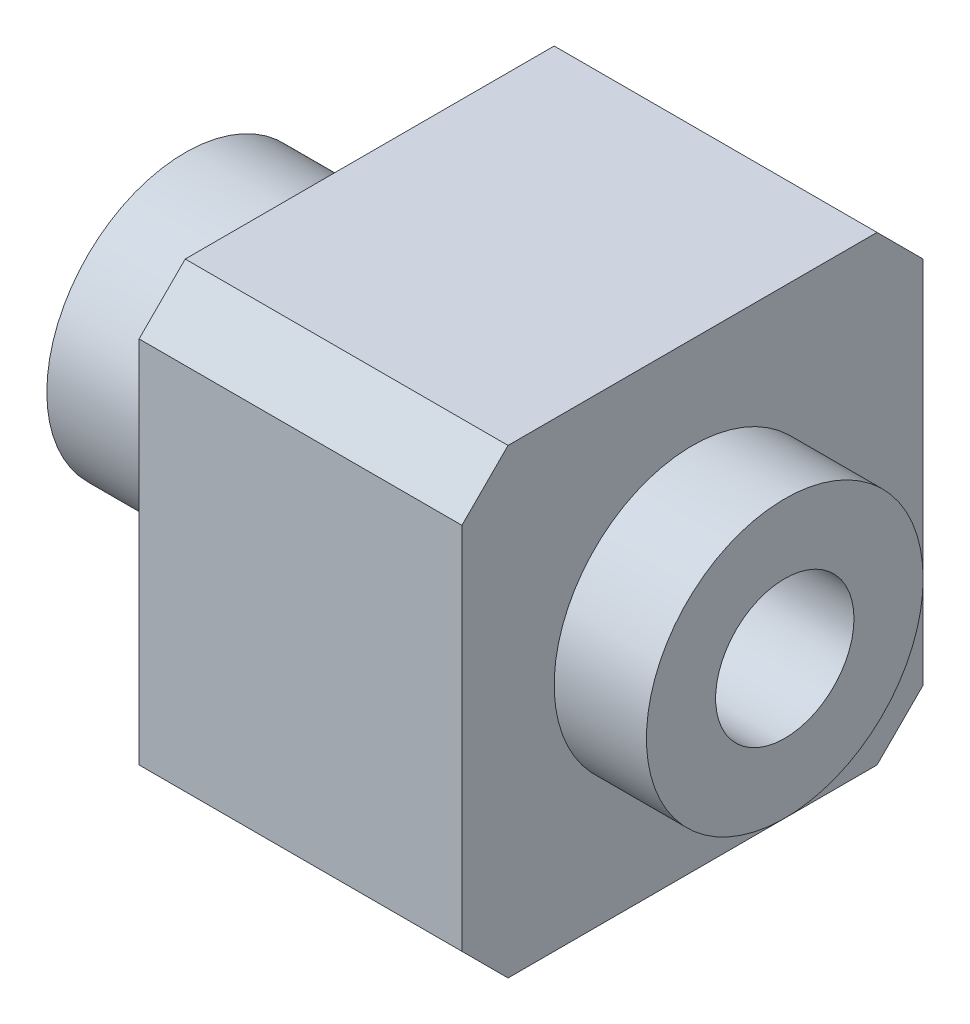
ISO-10303-21;
HEADER;
FILE_DESCRIPTION(('STEP AP214'),'2;1');
FILE_NAME('part.step','',(''),(''),'','','');
FILE_SCHEMA(('AUTOMOTIVE_DESIGN { 1 0 10303 214 1 1 1 1 }'));
ENDSEC;
DATA;
#1=APPLICATION_CONTEXT('core data for automotive mechanical design processes');
#2=APPLICATION_PROTOCOL_DEFINITION('international standard','automotive_design',2000,#1);
#3=PRODUCT_CONTEXT('',#1,'mechanical');
#4=PRODUCT('Part','Part','',(#3));
#5=PRODUCT_RELATED_PRODUCT_CATEGORY('part','',(#4));
#6=PRODUCT_DEFINITION_FORMATION('','',#4);
#7=PRODUCT_DEFINITION_CONTEXT('part definition',#1,'design');
#8=PRODUCT_DEFINITION('design','',#6,#7);
#9=PRODUCT_DEFINITION_SHAPE('','',#8);
#10=(LENGTH_UNIT() NAMED_UNIT(*) SI_UNIT(.MILLI.,.METRE.));
#11=(NAMED_UNIT(*) PLANE_ANGLE_UNIT() SI_UNIT($,.RADIAN.));
#12=(NAMED_UNIT(*) SI_UNIT($,.STERADIAN.) SOLID_ANGLE_UNIT());
#13=UNCERTAINTY_MEASURE_WITH_UNIT(LENGTH_MEASURE(1.E-05),#10,'distance_accuracy_value','');
#14=(GEOMETRIC_REPRESENTATION_CONTEXT(3) GLOBAL_UNCERTAINTY_ASSIGNED_CONTEXT((#13)) GLOBAL_UNIT_ASSIGNED_CONTEXT((#10,
#11,#12)) REPRESENTATION_CONTEXT('',''));
#15=CARTESIAN_POINT('',(0.,0.,0.));
#16=DIRECTION('',(0.,0.,1.));
#17=DIRECTION('',(1.,0.,0.));
#18=AXIS2_PLACEMENT_3D('',#15,#16,#17);
#19=CARTESIAN_POINT('',(-13.,-5.,5.));
#20=DIRECTION('',(0.,0.,1.));
#21=DIRECTION('',(1.,0.,0.));
#22=AXIS2_PLACEMENT_3D('',#19,#20,#21);
#23=PLANE('',#22);
#24=DIRECTION('',(0.,1.,0.));
#25=VECTOR('',#24,1.);
#26=CARTESIAN_POINT('',(-2.,-5.,5.));
#27=LINE('',#26,#25);
#28=CARTESIAN_POINT('',(-2.,-4.,5.));
#29=VERTEX_POINT('',#28);
#30=CARTESIAN_POINT('',(-2.,4.,5.));
#31=VERTEX_POINT('',#30);
#32=EDGE_CURVE('E131',#29,#31,#27,.T.);
#33=ORIENTED_EDGE('',*,*,#32,.T.);
#34=DIRECTION('',(-1.,0.,0.));
#35=VECTOR('',#34,1.);
#36=CARTESIAN_POINT('',(-13.,4.,5.));
#37=LINE('',#36,#35);
#38=CARTESIAN_POINT('',(-9.,4.,5.));
#39=VERTEX_POINT('',#38);
#40=EDGE_CURVE('E11',#31,#39,#37,.T.);
#41=ORIENTED_EDGE('',*,*,#40,.T.);
#42=DIRECTION('',(0.,-1.,0.));
#43=VECTOR('',#42,1.);
#44=CARTESIAN_POINT('',(-9.,-5.,5.));
#45=LINE('',#44,#43);
#46=CARTESIAN_POINT('',(-9.,-4.,5.));
#47=VERTEX_POINT('',#46);
#48=EDGE_CURVE('E132',#39,#47,#45,.T.);
#49=ORIENTED_EDGE('',*,*,#48,.T.);
#50=DIRECTION('',(1.,0.,0.));
#51=VECTOR('',#50,1.);
#52=CARTESIAN_POINT('',(-13.,-4.,5.));
#53=LINE('',#52,#51);
#54=EDGE_CURVE('E40',#47,#29,#53,.T.);
#55=ORIENTED_EDGE('',*,*,#54,.T.);
#56=EDGE_LOOP('',(#33,#41,#49,#55));
#57=FACE_BOUND('',#56,.T.);
#58=ADVANCED_FACE('F32',(#57),#23,.T.);
#59=CARTESIAN_POINT('',(-13.,5.,-5.));
#60=DIRECTION('',(0.,1.,0.));
#61=DIRECTION('',(0.,0.,1.));
#62=AXIS2_PLACEMENT_3D('',#59,#60,#61);
#63=PLANE('',#62);
#64=DIRECTION('',(0.,0.,1.));
#65=VECTOR('',#64,1.);
#66=CARTESIAN_POINT('',(-9.,5.,-5.));
#67=LINE('',#66,#65);
#68=CARTESIAN_POINT('',(-9.,5.,-4.));
#69=VERTEX_POINT('',#68);
#70=CARTESIAN_POINT('',(-9.,5.,4.));
#71=VERTEX_POINT('',#70);
#72=EDGE_CURVE('E167',#69,#71,#67,.T.);
#73=ORIENTED_EDGE('',*,*,#72,.T.);
#74=DIRECTION('',(1.,0.,0.));
#75=VECTOR('',#74,1.);
#76=CARTESIAN_POINT('',(-13.,5.,4.));
#77=LINE('',#76,#75);
#78=CARTESIAN_POINT('',(-2.,5.,4.));
#79=VERTEX_POINT('',#78);
#80=EDGE_CURVE('E128',#71,#79,#77,.T.);
#81=ORIENTED_EDGE('',*,*,#80,.T.);
#82=DIRECTION('',(0.,0.,-1.));
#83=VECTOR('',#82,1.);
#84=CARTESIAN_POINT('',(-2.,5.,-5.));
#85=LINE('',#84,#83);
#86=CARTESIAN_POINT('',(-2.,5.,-4.));
#87=VERTEX_POINT('',#86);
#88=EDGE_CURVE('E139',#79,#87,#85,.T.);
#89=ORIENTED_EDGE('',*,*,#88,.T.);
#90=DIRECTION('',(-1.,0.,0.));
#91=VECTOR('',#90,1.);
#92=CARTESIAN_POINT('',(-13.,5.,-4.));
#93=LINE('',#92,#91);
#94=EDGE_CURVE('E126',#87,#69,#93,.T.);
#95=ORIENTED_EDGE('',*,*,#94,.T.);
#96=EDGE_LOOP('',(#73,#81,#89,#95));
#97=FACE_BOUND('',#96,.T.);
#98=ADVANCED_FACE('F208',(#97),#63,.T.);
#99=CARTESIAN_POINT('',(-13.,-5.,-5.));
#100=DIRECTION('',(0.,0.,-1.));
#101=DIRECTION('',(-1.,0.,0.));
#102=AXIS2_PLACEMENT_3D('',#99,#100,#101);
#103=PLANE('',#102);
#104=CARTESIAN_POINT('',(-5.5,0.,-5.));
#105=DIRECTION('',(0.,0.,-1.));
#106=DIRECTION('',(-1.,0.,0.));
#107=AXIS2_PLACEMENT_3D('',#104,#105,#106);
#108=CIRCLE('',#107,1.5);
#109=CARTESIAN_POINT('',(-7.,0.,-5.));
#110=VERTEX_POINT('',#109);
#111=EDGE_CURVE('E193',#110,#110,#108,.T.);
#112=ORIENTED_EDGE('',*,*,#111,.F.);
#113=EDGE_LOOP('',(#112));
#114=FACE_BOUND('',#113,.T.);
#115=DIRECTION('',(0.,-1.,0.));
#116=VECTOR('',#115,1.);
#117=CARTESIAN_POINT('',(-2.,-5.,-5.));
#118=LINE('',#117,#116);
#119=CARTESIAN_POINT('',(-2.,4.,-5.));
#120=VERTEX_POINT('',#119);
#121=CARTESIAN_POINT('',(-2.,-3.99999999999999,-5.));
#122=VERTEX_POINT('',#121);
#123=EDGE_CURVE('E143',#120,#122,#118,.T.);
#124=ORIENTED_EDGE('',*,*,#123,.T.);
#125=DIRECTION('',(-1.,0.,0.));
#126=VECTOR('',#125,1.);
#127=CARTESIAN_POINT('',(-13.,-3.99999999999999,-5.));
#128=LINE('',#127,#126);
#129=CARTESIAN_POINT('',(-9.,-3.99999999999999,-5.));
#130=VERTEX_POINT('',#129);
#131=EDGE_CURVE('E121',#122,#130,#128,.T.);
#132=ORIENTED_EDGE('',*,*,#131,.T.);
#133=DIRECTION('',(0.,1.,0.));
#134=VECTOR('',#133,1.);
#135=CARTESIAN_POINT('',(-9.,-5.,-5.));
#136=LINE('',#135,#134);
#137=CARTESIAN_POINT('',(-9.,4.,-5.));
#138=VERTEX_POINT('',#137);
#139=EDGE_CURVE('E161',#130,#138,#136,.T.);
#140=ORIENTED_EDGE('',*,*,#139,.T.);
#141=DIRECTION('',(1.,0.,0.));
#142=VECTOR('',#141,1.);
#143=CARTESIAN_POINT('',(-13.,4.,-5.));
#144=LINE('',#143,#142);
#145=EDGE_CURVE('E154',#138,#120,#144,.T.);
#146=ORIENTED_EDGE('',*,*,#145,.T.);
#147=EDGE_LOOP('',(#124,#132,#140,#146));
#148=FACE_BOUND('',#147,.T.);
#149=ADVANCED_FACE('F160',(#114,#148),#103,.T.);
#150=CARTESIAN_POINT('',(-13.,-5.,-5.));
#151=DIRECTION('',(0.,-1.,0.));
#152=DIRECTION('',(0.,0.,-1.));
#153=AXIS2_PLACEMENT_3D('',#150,#151,#152);
#154=PLANE('',#153);
#155=DIRECTION('',(0.,0.,-1.));
#156=VECTOR('',#155,1.);
#157=CARTESIAN_POINT('',(-9.,-5.,-5.));
#158=LINE('',#157,#156);
#159=CARTESIAN_POINT('',(-9.,-5.,3.99999999999999));
#160=VERTEX_POINT('',#159);
#161=CARTESIAN_POINT('',(-9.,-5.,-3.99999999999999));
#162=VERTEX_POINT('',#161);
#163=EDGE_CURVE('E101',#160,#162,#158,.T.);
#164=ORIENTED_EDGE('',*,*,#163,.T.);
#165=DIRECTION('',(1.,0.,0.));
#166=VECTOR('',#165,1.);
#167=CARTESIAN_POINT('',(-13.,-5.,-3.99999999999999));
#168=LINE('',#167,#166);
#169=CARTESIAN_POINT('',(-2.,-5.,-3.99999999999999));
#170=VERTEX_POINT('',#169);
#171=EDGE_CURVE('E106',#162,#170,#168,.T.);
#172=ORIENTED_EDGE('',*,*,#171,.T.);
#173=DIRECTION('',(0.,0.,1.));
#174=VECTOR('',#173,1.);
#175=CARTESIAN_POINT('',(-2.,-5.,-5.));
#176=LINE('',#175,#174);
#177=CARTESIAN_POINT('',(-2.,-5.,3.99999999999999));
#178=VERTEX_POINT('',#177);
#179=EDGE_CURVE('E104',#170,#178,#176,.T.);
#180=ORIENTED_EDGE('',*,*,#179,.T.);
#181=DIRECTION('',(-1.,0.,0.));
#182=VECTOR('',#181,1.);
#183=CARTESIAN_POINT('',(-13.,-5.,3.99999999999999));
#184=LINE('',#183,#182);
#185=EDGE_CURVE('E98',#178,#160,#184,.T.);
#186=ORIENTED_EDGE('',*,*,#185,.T.);
#187=EDGE_LOOP('',(#164,#172,#180,#186));
#188=FACE_BOUND('',#187,.T.);
#189=ADVANCED_FACE('F99',(#188),#154,.T.);
#190=CARTESIAN_POINT('',(-2.,0.,0.));
#191=DIRECTION('',(1.,0.,0.));
#192=DIRECTION('',(0.,0.,-1.));
#193=AXIS2_PLACEMENT_3D('',#190,#191,#192);
#194=PLANE('',#193);
#195=ORIENTED_EDGE('',*,*,#179,.F.);
#196=DIRECTION('',(0.,-0.707106781186549,0.707106781186546));
#197=VECTOR('',#196,1.);
#198=CARTESIAN_POINT('',(-2.,-4.49999999999998,-4.50000000000001));
#199=LINE('',#198,#197);
#200=EDGE_CURVE('E152',#170,#122,#199,.F.);
#201=ORIENTED_EDGE('',*,*,#200,.T.);
#202=ORIENTED_EDGE('',*,*,#123,.F.);
#203=DIRECTION('',(0.,-0.707106781186547,-0.707106781186548));
#204=VECTOR('',#203,1.);
#205=CARTESIAN_POINT('',(-2.,4.50000000000001,-4.49999999999999));
#206=LINE('',#205,#204);
#207=EDGE_CURVE('E148',#120,#87,#206,.F.);
#208=ORIENTED_EDGE('',*,*,#207,.T.);
#209=ORIENTED_EDGE('',*,*,#88,.F.);
#210=DIRECTION('',(0.,0.707106781186548,-0.707106781186547));
#211=VECTOR('',#210,1.);
#212=CARTESIAN_POINT('',(-2.,4.5,4.5));
#213=LINE('',#212,#211);
#214=EDGE_CURVE('E138',#79,#31,#213,.F.);
#215=ORIENTED_EDGE('',*,*,#214,.T.);
#216=ORIENTED_EDGE('',*,*,#32,.F.);
#217=DIRECTION('',(0.,0.707106781186546,0.707106781186549));
#218=VECTOR('',#217,1.);
#219=CARTESIAN_POINT('',(-2.,-4.50000000000001,4.49999999999999));
#220=LINE('',#219,#218);
#221=EDGE_CURVE('E136',#29,#178,#220,.F.);
#222=ORIENTED_EDGE('',*,*,#221,.T.);
#223=EDGE_LOOP('',(#195,#201,#202,#208,#209,#215,#216,#222));
#224=FACE_BOUND('',#223,.T.);
#225=CARTESIAN_POINT('',(-2.,0.,0.));
#226=DIRECTION('',(1.,0.,0.));
#227=DIRECTION('',(0.,0.,-1.));
#228=AXIS2_PLACEMENT_3D('',#225,#226,#227);
#229=CIRCLE('',#228,3.);
#230=CARTESIAN_POINT('',(-2.,0.,-3.));
#231=VERTEX_POINT('',#230);
#232=EDGE_CURVE('E171',#231,#231,#229,.T.);
#233=ORIENTED_EDGE('',*,*,#232,.F.);
#234=EDGE_LOOP('',(#233));
#235=FACE_BOUND('',#234,.T.);
#236=ADVANCED_FACE('F134',(#224,#235),#194,.T.);
#237=CARTESIAN_POINT('',(-2.,0.,0.));
#238=DIRECTION('',(1.,0.,0.));
#239=DIRECTION('',(0.,0.,-1.));
#240=AXIS2_PLACEMENT_3D('',#237,#238,#239);
#241=CYLINDRICAL_SURFACE('',#240,3.);
#242=ORIENTED_EDGE('',*,*,#232,.T.);
#243=EDGE_LOOP('',(#242));
#244=FACE_BOUND('',#243,.T.);
#245=CARTESIAN_POINT('',(0.,0.,0.));
#246=DIRECTION('',(1.,0.,0.));
#247=DIRECTION('',(0.,0.,-1.));
#248=AXIS2_PLACEMENT_3D('',#245,#246,#247);
#249=CIRCLE('',#248,3.);
#250=CARTESIAN_POINT('',(0.,0.,-3.));
#251=VERTEX_POINT('',#250);
#252=EDGE_CURVE('E173',#251,#251,#249,.T.);
#253=ORIENTED_EDGE('',*,*,#252,.F.);
#254=EDGE_LOOP('',(#253));
#255=FACE_BOUND('',#254,.T.);
#256=ADVANCED_FACE('F326',(#244,#255),#241,.T.);
#257=CARTESIAN_POINT('',(0.,0.,0.));
#258=DIRECTION('',(1.,0.,0.));
#259=DIRECTION('',(0.,0.,-1.));
#260=AXIS2_PLACEMENT_3D('',#257,#258,#259);
#261=PLANE('',#260);
#262=CARTESIAN_POINT('',(0.,0.,0.));
#263=DIRECTION('',(1.,0.,0.));
#264=DIRECTION('',(0.,0.,-1.));
#265=AXIS2_PLACEMENT_3D('',#262,#263,#264);
#266=CIRCLE('',#265,1.5);
#267=CARTESIAN_POINT('',(0.,0.,-1.5));
#268=VERTEX_POINT('',#267);
#269=EDGE_CURVE('E187',#268,#268,#266,.T.);
#270=ORIENTED_EDGE('',*,*,#269,.F.);
#271=EDGE_LOOP('',(#270));
#272=FACE_BOUND('',#271,.T.);
#273=ORIENTED_EDGE('',*,*,#252,.T.);
#274=EDGE_LOOP('',(#273));
#275=FACE_BOUND('',#274,.T.);
#276=ADVANCED_FACE('F297',(#272,#275),#261,.T.);
#277=CARTESIAN_POINT('',(-9.,0.,0.));
#278=DIRECTION('',(-1.,0.,0.));
#279=DIRECTION('',(0.,0.,1.));
#280=AXIS2_PLACEMENT_3D('',#277,#278,#279);
#281=PLANE('',#280);
#282=ORIENTED_EDGE('',*,*,#139,.F.);
#283=DIRECTION('',(0.,0.707106781186549,-0.707106781186546));
#284=VECTOR('',#283,1.);
#285=CARTESIAN_POINT('',(-9.,-4.49999999999998,-4.50000000000001));
#286=LINE('',#285,#284);
#287=EDGE_CURVE('E112',#130,#162,#286,.F.);
#288=ORIENTED_EDGE('',*,*,#287,.T.);
#289=ORIENTED_EDGE('',*,*,#163,.F.);
#290=DIRECTION('',(0.,-0.707106781186546,-0.707106781186549));
#291=VECTOR('',#290,1.);
#292=CARTESIAN_POINT('',(-9.,-4.50000000000001,4.49999999999999));
#293=LINE('',#292,#291);
#294=EDGE_CURVE('E47',#160,#47,#293,.F.);
#295=ORIENTED_EDGE('',*,*,#294,.T.);
#296=ORIENTED_EDGE('',*,*,#48,.F.);
#297=DIRECTION('',(0.,-0.707106781186548,0.707106781186547));
#298=VECTOR('',#297,1.);
#299=CARTESIAN_POINT('',(-9.,4.5,4.5));
#300=LINE('',#299,#298);
#301=EDGE_CURVE('E117',#39,#71,#300,.F.);
#302=ORIENTED_EDGE('',*,*,#301,.T.);
#303=ORIENTED_EDGE('',*,*,#72,.F.);
#304=DIRECTION('',(0.,0.707106781186547,0.707106781186548));
#305=VECTOR('',#304,1.);
#306=CARTESIAN_POINT('',(-9.,4.50000000000001,-4.49999999999999));
#307=LINE('',#306,#305);
#308=EDGE_CURVE('E118',#69,#138,#307,.F.);
#309=ORIENTED_EDGE('',*,*,#308,.T.);
#310=EDGE_LOOP('',(#282,#288,#289,#295,#296,#302,#303,#309));
#311=FACE_BOUND('',#310,.T.);
#312=CARTESIAN_POINT('',(-9.,0.,0.));
#313=DIRECTION('',(-1.,0.,0.));
#314=DIRECTION('',(0.,0.,1.));
#315=AXIS2_PLACEMENT_3D('',#312,#313,#314);
#316=CIRCLE('',#315,3.);
#317=CARTESIAN_POINT('',(-9.,0.,3.));
#318=VERTEX_POINT('',#317);
#319=EDGE_CURVE('E168',#318,#318,#316,.T.);
#320=ORIENTED_EDGE('',*,*,#319,.F.);
#321=EDGE_LOOP('',(#320));
#322=FACE_BOUND('',#321,.T.);
#323=ADVANCED_FACE('F109',(#311,#322),#281,.T.);
#324=CARTESIAN_POINT('',(-9.,0.,0.));
#325=DIRECTION('',(-1.,0.,0.));
#326=DIRECTION('',(0.,0.,1.));
#327=AXIS2_PLACEMENT_3D('',#324,#325,#326);
#328=CYLINDRICAL_SURFACE('',#327,3.);
#329=ORIENTED_EDGE('',*,*,#319,.T.);
#330=EDGE_LOOP('',(#329));
#331=FACE_BOUND('',#330,.T.);
#332=CARTESIAN_POINT('',(-13.,0.,0.));
#333=DIRECTION('',(-1.,0.,0.));
#334=DIRECTION('',(0.,0.,1.));
#335=AXIS2_PLACEMENT_3D('',#332,#333,#334);
#336=CIRCLE('',#335,3.);
#337=CARTESIAN_POINT('',(-13.,0.,3.));
#338=VERTEX_POINT('',#337);
#339=EDGE_CURVE('E181',#338,#338,#336,.T.);
#340=ORIENTED_EDGE('',*,*,#339,.F.);
#341=EDGE_LOOP('',(#340));
#342=FACE_BOUND('',#341,.T.);
#343=ADVANCED_FACE('F282',(#331,#342),#328,.T.);
#344=CARTESIAN_POINT('',(-13.,0.,0.));
#345=DIRECTION('',(1.,0.,0.));
#346=DIRECTION('',(0.,0.,-1.));
#347=AXIS2_PLACEMENT_3D('',#344,#345,#346);
#348=PLANE('',#347);
#349=CARTESIAN_POINT('',(-13.,0.,0.));
#350=DIRECTION('',(1.,0.,0.));
#351=DIRECTION('',(0.,0.,-1.));
#352=AXIS2_PLACEMENT_3D('',#349,#350,#351);
#353=CIRCLE('',#352,1.5);
#354=CARTESIAN_POINT('',(-13.,0.,-1.5));
#355=VERTEX_POINT('',#354);
#356=EDGE_CURVE('E184',#355,#355,#353,.T.);
#357=ORIENTED_EDGE('',*,*,#356,.T.);
#358=EDGE_LOOP('',(#357));
#359=FACE_BOUND('',#358,.T.);
#360=ORIENTED_EDGE('',*,*,#339,.T.);
#361=EDGE_LOOP('',(#360));
#362=FACE_BOUND('',#361,.T.);
#363=ADVANCED_FACE('F277',(#359,#362),#348,.F.);
#364=CARTESIAN_POINT('',(-13.,0.,0.));
#365=DIRECTION('',(1.,0.,0.));
#366=DIRECTION('',(0.,0.,-1.));
#367=AXIS2_PLACEMENT_3D('',#364,#365,#366);
#368=CYLINDRICAL_SURFACE('',#367,1.5);
#369=CARTESIAN_POINT('',(-13.,0.,-1.5));
#370=CARTESIAN_POINT('',(-12.8645833333333,0.,-1.5));
#371=CARTESIAN_POINT('',(-12.7291666666667,0.,-1.5));
#372=CARTESIAN_POINT('',(-12.4583333333333,0.,-1.5));
#373=CARTESIAN_POINT('',(-12.3229166666667,0.,-1.5));
#374=CARTESIAN_POINT('',(-12.0520833333333,0.,-1.5));
#375=CARTESIAN_POINT('',(-11.9166666666667,0.,-1.5));
#376=CARTESIAN_POINT('',(-11.6458333333333,0.,-1.5));
#377=CARTESIAN_POINT('',(-11.5104166666667,0.,-1.5));
#378=CARTESIAN_POINT('',(-11.2395833333333,0.,-1.5));
#379=CARTESIAN_POINT('',(-11.1041666666667,0.,-1.5));
#380=CARTESIAN_POINT('',(-10.8333333333333,0.,-1.5));
#381=CARTESIAN_POINT('',(-10.6979166666667,0.,-1.5));
#382=CARTESIAN_POINT('',(-10.4270833333333,0.,-1.5));
#383=CARTESIAN_POINT('',(-10.2916666666667,0.,-1.5));
#384=CARTESIAN_POINT('',(-10.0208333333333,0.,-1.5));
#385=CARTESIAN_POINT('',(-9.88541666666667,0.,-1.5));
#386=CARTESIAN_POINT('',(-9.61458333333333,0.,-1.5));
#387=CARTESIAN_POINT('',(-9.47916666666667,0.,-1.5));
#388=CARTESIAN_POINT('',(-9.20833333333333,0.,-1.5));
#389=CARTESIAN_POINT('',(-9.07291666666667,0.,-1.5));
#390=CARTESIAN_POINT('',(-8.80208333333333,0.,-1.5));
#391=CARTESIAN_POINT('',(-8.66666666666667,0.,-1.5));
#392=CARTESIAN_POINT('',(-8.39583333333333,0.,-1.5));
#393=CARTESIAN_POINT('',(-8.26041666666667,0.,-1.5));
#394=CARTESIAN_POINT('',(-7.98958333333333,0.,-1.5));
#395=CARTESIAN_POINT('',(-7.85416666666667,0.,-1.5));
#396=CARTESIAN_POINT('',(-7.58333333333333,0.,-1.5));
#397=CARTESIAN_POINT('',(-7.44791666666667,0.,-1.5));
#398=CARTESIAN_POINT('',(-7.17708333333333,0.,-1.5));
#399=CARTESIAN_POINT('',(-7.04166666666667,0.,-1.5));
#400=CARTESIAN_POINT('',(-6.77083333333333,0.,-1.5));
#401=CARTESIAN_POINT('',(-6.63541666666667,0.,-1.5));
#402=CARTESIAN_POINT('',(-6.36458333333333,0.,-1.5));
#403=CARTESIAN_POINT('',(-6.22916666666667,0.,-1.5));
#404=CARTESIAN_POINT('',(-5.95833333333333,0.,-1.5));
#405=CARTESIAN_POINT('',(-5.82291666666667,0.,-1.5));
#406=CARTESIAN_POINT('',(-5.55208333333333,0.,-1.5));
#407=CARTESIAN_POINT('',(-5.41666666666667,0.,-1.5));
#408=CARTESIAN_POINT('',(-5.14583333333333,0.,-1.5));
#409=CARTESIAN_POINT('',(-5.01041666666667,0.,-1.5));
#410=CARTESIAN_POINT('',(-4.73958333333333,0.,-1.5));
#411=CARTESIAN_POINT('',(-4.60416666666667,0.,-1.5));
#412=CARTESIAN_POINT('',(-4.33333333333333,0.,-1.5));
#413=CARTESIAN_POINT('',(-4.19791666666667,0.,-1.5));
#414=CARTESIAN_POINT('',(-3.92708333333333,0.,-1.5));
#415=CARTESIAN_POINT('',(-3.79166666666667,0.,-1.5));
#416=CARTESIAN_POINT('',(-3.52083333333333,0.,-1.5));
#417=CARTESIAN_POINT('',(-3.38541666666667,0.,-1.5));
#418=CARTESIAN_POINT('',(-3.11458333333333,0.,-1.5));
#419=CARTESIAN_POINT('',(-2.97916666666667,0.,-1.5));
#420=CARTESIAN_POINT('',(-2.70833333333333,0.,-1.5));
#421=CARTESIAN_POINT('',(-2.57291666666667,0.,-1.5));
#422=CARTESIAN_POINT('',(-2.30208333333333,0.,-1.5));
#423=CARTESIAN_POINT('',(-2.16666666666667,0.,-1.5));
#424=CARTESIAN_POINT('',(-1.89583333333333,0.,-1.5));
#425=CARTESIAN_POINT('',(-1.76041666666667,0.,-1.5));
#426=CARTESIAN_POINT('',(-1.48958333333333,0.,-1.5));
#427=CARTESIAN_POINT('',(-1.35416666666667,0.,-1.5));
#428=CARTESIAN_POINT('',(-1.08333333333333,0.,-1.5));
#429=CARTESIAN_POINT('',(-0.947916666666667,0.,-1.5));
#430=CARTESIAN_POINT('',(-0.677083333333334,0.,-1.5));
#431=CARTESIAN_POINT('',(-0.541666666666667,0.,-1.5));
#432=CARTESIAN_POINT('',(-0.270833333333334,0.,-1.5));
#433=CARTESIAN_POINT('',(-0.135416666666667,0.,-1.5));
#434=CARTESIAN_POINT('',(0.,0.,-1.5));
#435=B_SPLINE_CURVE_WITH_KNOTS('',3,(#369,#370,#371,#372,#373,#374,#375,#376,#377,#378,#379,
#380,#381,#382,#383,#384,#385,#386,#387,#388,#389,#390,#391,#392,#393,#394,#395,#396,#397,#398,
#399,#400,#401,#402,#403,#404,#405,#406,#407,#408,#409,#410,#411,#412,#413,#414,#415,#416,#417,
#418,#419,#420,#421,#422,#423,#424,#425,#426,#427,#428,#429,#430,#431,#432,#433,#434),
.UNSPECIFIED.,.F.,.F.,(4,2,2,2,2,2,2,2,2,2,2,2,2,2,2,2,2,2,2,2,2,2,2,2,2,2,2,2,2,2,2,2,4),(0.,
0.40625,0.812500000000001,1.21875,1.625,2.03125,2.4375,2.84375,3.25,3.65625,4.0625,4.46875,
4.875,5.28125,5.6875,6.09375,6.5,6.90625,7.3125,7.71875,8.125,8.53125,8.9375,9.34375,9.75,
10.15625,10.5625,10.96875,11.375,11.78125,12.1875,12.59375,13.),.UNSPECIFIED.);
#436=EDGE_CURVE('BSEAM225',#355,#268,#435,.T.);
#437=ORIENTED_EDGE('',*,*,#356,.F.);
#438=ORIENTED_EDGE('',*,*,#269,.T.);
#439=ORIENTED_EDGE('',*,*,#436,.T.);
#440=ORIENTED_EDGE('',*,*,#436,.F.);
#441=EDGE_LOOP('',(#437,#439,#438,#440));
#442=FACE_BOUND('',#441,.T.);
#443=ADVANCED_FACE('F225',(#442),#368,.F.);
#444=CARTESIAN_POINT('',(-13.,-5.,-3.99999999999999));
#445=DIRECTION('',(0.,0.707106781186546,0.707106781186549));
#446=DIRECTION('',(1.,0.,0.));
#447=AXIS2_PLACEMENT_3D('',#444,#445,#446);
#448=PLANE('',#447);
#449=ORIENTED_EDGE('',*,*,#287,.F.);
#450=ORIENTED_EDGE('',*,*,#131,.F.);
#451=ORIENTED_EDGE('',*,*,#200,.F.);
#452=ORIENTED_EDGE('',*,*,#171,.F.);
#453=EDGE_LOOP('',(#449,#450,#451,#452));
#454=FACE_BOUND('',#453,.T.);
#455=ADVANCED_FACE('F170',(#454),#448,.F.);
#456=CARTESIAN_POINT('',(-13.,5.,4.));
#457=DIRECTION('',(0.,-0.707106781186547,-0.707106781186548));
#458=DIRECTION('',(1.,0.,0.));
#459=AXIS2_PLACEMENT_3D('',#456,#457,#458);
#460=PLANE('',#459);
#461=ORIENTED_EDGE('',*,*,#301,.F.);
#462=ORIENTED_EDGE('',*,*,#40,.F.);
#463=ORIENTED_EDGE('',*,*,#214,.F.);
#464=ORIENTED_EDGE('',*,*,#80,.F.);
#465=EDGE_LOOP('',(#461,#462,#463,#464));
#466=FACE_BOUND('',#465,.T.);
#467=ADVANCED_FACE('F224',(#466),#460,.F.);
#468=CARTESIAN_POINT('',(-13.,-4.,5.));
#469=DIRECTION('',(0.,0.707106781186549,-0.707106781186546));
#470=DIRECTION('',(1.,0.,0.));
#471=AXIS2_PLACEMENT_3D('',#468,#469,#470);
#472=PLANE('',#471);
#473=ORIENTED_EDGE('',*,*,#294,.F.);
#474=ORIENTED_EDGE('',*,*,#185,.F.);
#475=ORIENTED_EDGE('',*,*,#221,.F.);
#476=ORIENTED_EDGE('',*,*,#54,.F.);
#477=EDGE_LOOP('',(#473,#474,#475,#476));
#478=FACE_BOUND('',#477,.T.);
#479=ADVANCED_FACE('F115',(#478),#472,.F.);
#480=CARTESIAN_POINT('',(-13.,4.,-5.));
#481=DIRECTION('',(0.,-0.707106781186548,0.707106781186547));
#482=DIRECTION('',(1.,0.,0.));
#483=AXIS2_PLACEMENT_3D('',#480,#481,#482);
#484=PLANE('',#483);
#485=ORIENTED_EDGE('',*,*,#308,.F.);
#486=ORIENTED_EDGE('',*,*,#94,.F.);
#487=ORIENTED_EDGE('',*,*,#207,.F.);
#488=ORIENTED_EDGE('',*,*,#145,.F.);
#489=EDGE_LOOP('',(#485,#486,#487,#488));
#490=FACE_BOUND('',#489,.T.);
#491=ADVANCED_FACE('F34',(#490),#484,.F.);
#492=CARTESIAN_POINT('',(-5.5,0.,-3.));
#493=DIRECTION('',(0.,0.,-1.));
#494=DIRECTION('',(-1.,0.,0.));
#495=AXIS2_PLACEMENT_3D('',#492,#493,#494);
#496=CYLINDRICAL_SURFACE('',#495,1.5);
#497=CARTESIAN_POINT('',(-5.5,0.,-3.));
#498=DIRECTION('',(0.,0.,-1.));
#499=DIRECTION('',(-1.,0.,0.));
#500=AXIS2_PLACEMENT_3D('',#497,#498,#499);
#501=CIRCLE('',#500,1.5);
#502=CARTESIAN_POINT('',(-7.,0.,-3.));
#503=VERTEX_POINT('',#502);
#504=EDGE_CURVE('E190',#503,#503,#501,.T.);
#505=ORIENTED_EDGE('',*,*,#504,.F.);
#506=EDGE_LOOP('',(#505));
#507=FACE_BOUND('',#506,.T.);
#508=ORIENTED_EDGE('',*,*,#111,.T.);
#509=EDGE_LOOP('',(#508));
#510=FACE_BOUND('',#509,.T.);
#511=ADVANCED_FACE('F201',(#507,#510),#496,.F.);
#512=CARTESIAN_POINT('',(-5.5,0.,-3.));
#513=DIRECTION('',(0.,0.,-1.));
#514=DIRECTION('',(-1.,0.,0.));
#515=AXIS2_PLACEMENT_3D('',#512,#513,#514);
#516=PLANE('',#515);
#517=ORIENTED_EDGE('',*,*,#504,.T.);
#518=EDGE_LOOP('',(#517));
#519=FACE_BOUND('',#518,.T.);
#520=ADVANCED_FACE('F199',(#519),#516,.T.);
#521=CLOSED_SHELL('',(#58,#98,#149,#189,#236,#256,#276,#323,#343,#363,#443,#455,#467,#479,#491,
#511,#520));
#522=MANIFOLD_SOLID_BREP('B2',#521);
#523=ADVANCED_BREP_SHAPE_REPRESENTATION('',(#18,#522),#14);
#524=SHAPE_DEFINITION_REPRESENTATION(#9,#523);
ENDSEC;
END-ISO-10303-21;
